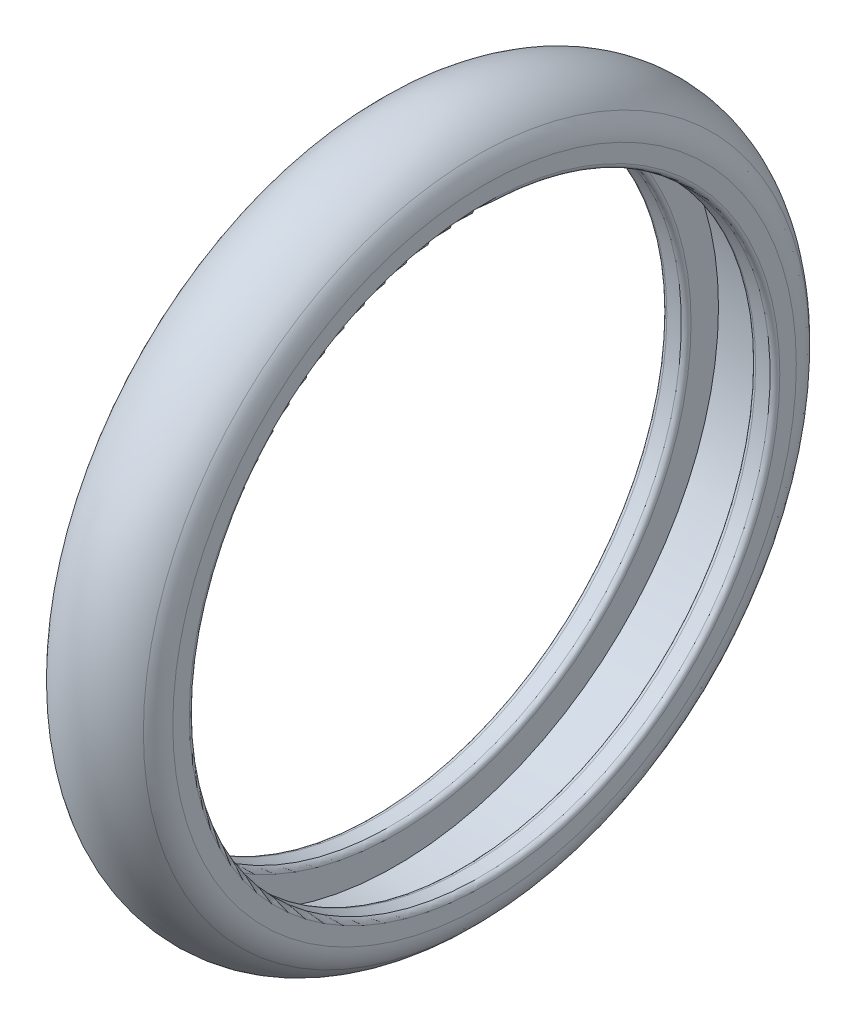
ISO-10303-21;
HEADER;
FILE_DESCRIPTION(('STEP AP214'),'2;1');
FILE_NAME('part.step','',(''),(''),'','','');
FILE_SCHEMA(('AUTOMOTIVE_DESIGN { 1 0 10303 214 1 1 1 1 }'));
ENDSEC;
DATA;
#1=APPLICATION_CONTEXT('core data for automotive mechanical design processes');
#2=APPLICATION_PROTOCOL_DEFINITION('international standard','automotive_design',2000,#1);
#3=PRODUCT_CONTEXT('',#1,'mechanical');
#4=PRODUCT('Part','Part','',(#3));
#5=PRODUCT_RELATED_PRODUCT_CATEGORY('part','',(#4));
#6=PRODUCT_DEFINITION_FORMATION('','',#4);
#7=PRODUCT_DEFINITION_CONTEXT('part definition',#1,'design');
#8=PRODUCT_DEFINITION('design','',#6,#7);
#9=PRODUCT_DEFINITION_SHAPE('','',#8);
#10=(LENGTH_UNIT() NAMED_UNIT(*) SI_UNIT(.MILLI.,.METRE.));
#11=(NAMED_UNIT(*) PLANE_ANGLE_UNIT() SI_UNIT($,.RADIAN.));
#12=(NAMED_UNIT(*) SI_UNIT($,.STERADIAN.) SOLID_ANGLE_UNIT());
#13=UNCERTAINTY_MEASURE_WITH_UNIT(LENGTH_MEASURE(1.E-05),#10,'distance_accuracy_value','');
#14=(GEOMETRIC_REPRESENTATION_CONTEXT(3) GLOBAL_UNCERTAINTY_ASSIGNED_CONTEXT((#13)) GLOBAL_UNIT_ASSIGNED_CONTEXT((#10,
#11,#12)) REPRESENTATION_CONTEXT('',''));
#15=CARTESIAN_POINT('',(0.,0.,0.));
#16=DIRECTION('',(0.,0.,1.));
#17=DIRECTION('',(1.,0.,0.));
#18=AXIS2_PLACEMENT_3D('',#15,#16,#17);
#19=CARTESIAN_POINT('',(0.,0.,0.));
#20=DIRECTION('',(-1.,0.,0.));
#21=DIRECTION('',(0.,0.,1.));
#22=AXIS2_PLACEMENT_3D('',#19,#20,#21);
#23=CYLINDRICAL_SURFACE('',#22,18.);
#24=CARTESIAN_POINT('',(2.3,0.,0.));
#25=DIRECTION('',(1.,0.,0.));
#26=DIRECTION('',(0.,0.,-1.));
#27=AXIS2_PLACEMENT_3D('',#24,#25,#26);
#28=CIRCLE('',#27,18.);
#29=CARTESIAN_POINT('',(2.3,0.,-18.));
#30=VERTEX_POINT('',#29);
#31=EDGE_CURVE('E68',#30,#30,#28,.F.);
#32=ORIENTED_EDGE('',*,*,#31,.T.);
#33=EDGE_LOOP('',(#32));
#34=FACE_BOUND('',#33,.T.);
#35=CARTESIAN_POINT('',(3.2,0.,0.));
#36=DIRECTION('',(-1.,0.,0.));
#37=DIRECTION('',(0.,0.,1.));
#38=AXIS2_PLACEMENT_3D('',#35,#36,#37);
#39=CIRCLE('',#38,18.);
#40=CARTESIAN_POINT('',(3.2,0.,18.));
#41=VERTEX_POINT('',#40);
#42=EDGE_CURVE('E72',#41,#41,#39,.F.);
#43=ORIENTED_EDGE('',*,*,#42,.T.);
#44=EDGE_LOOP('',(#43));
#45=FACE_BOUND('',#44,.T.);
#46=ADVANCED_FACE('F35',(#34,#45),#23,.F.);
#47=CARTESIAN_POINT('',(2.,20.,0.));
#48=DIRECTION('',(1.,0.,0.));
#49=DIRECTION('',(0.,0.,-1.));
#50=AXIS2_PLACEMENT_3D('',#47,#48,#49);
#51=PLANE('',#50);
#52=CARTESIAN_POINT('',(2.,0.,0.));
#53=DIRECTION('',(1.,0.,0.));
#54=DIRECTION('',(0.,0.,-1.));
#55=AXIS2_PLACEMENT_3D('',#52,#53,#54);
#56=CIRCLE('',#55,18.3);
#57=CARTESIAN_POINT('',(2.,0.,-18.3));
#58=VERTEX_POINT('',#57);
#59=EDGE_CURVE('E64',#58,#58,#56,.T.);
#60=ORIENTED_EDGE('',*,*,#59,.T.);
#61=EDGE_LOOP('',(#60));
#62=FACE_BOUND('',#61,.T.);
#63=CARTESIAN_POINT('',(2.,0.,0.));
#64=DIRECTION('',(-1.,0.,0.));
#65=DIRECTION('',(0.,0.,1.));
#66=AXIS2_PLACEMENT_3D('',#63,#64,#65);
#67=CIRCLE('',#66,20.);
#68=CARTESIAN_POINT('',(2.,0.,20.));
#69=VERTEX_POINT('',#68);
#70=EDGE_CURVE('E89',#69,#69,#67,.T.);
#71=ORIENTED_EDGE('',*,*,#70,.T.);
#72=EDGE_LOOP('',(#71));
#73=FACE_BOUND('',#72,.T.);
#74=ADVANCED_FACE('F112',(#62,#73),#51,.F.);
#75=CARTESIAN_POINT('',(0.,0.,0.));
#76=DIRECTION('',(-1.,0.,0.));
#77=DIRECTION('',(0.,0.,1.));
#78=AXIS2_PLACEMENT_3D('',#75,#76,#77);
#79=CYLINDRICAL_SURFACE('',#78,20.);
#80=ORIENTED_EDGE('',*,*,#70,.F.);
#81=EDGE_LOOP('',(#80));
#82=FACE_BOUND('',#81,.T.);
#83=CARTESIAN_POINT('',(-2.,0.,0.));
#84=DIRECTION('',(-1.,0.,0.));
#85=DIRECTION('',(0.,0.,1.));
#86=AXIS2_PLACEMENT_3D('',#83,#84,#85);
#87=CIRCLE('',#86,20.);
#88=CARTESIAN_POINT('',(-2.,0.,20.));
#89=VERTEX_POINT('',#88);
#90=EDGE_CURVE('E93',#89,#89,#87,.T.);
#91=ORIENTED_EDGE('',*,*,#90,.T.);
#92=EDGE_LOOP('',(#91));
#93=FACE_BOUND('',#92,.T.);
#94=ADVANCED_FACE('F98',(#82,#93),#79,.F.);
#95=CARTESIAN_POINT('',(-2.,20.,0.));
#96=DIRECTION('',(-1.,0.,0.));
#97=DIRECTION('',(0.,0.,1.));
#98=AXIS2_PLACEMENT_3D('',#95,#96,#97);
#99=PLANE('',#98);
#100=CARTESIAN_POINT('',(-2.,0.,0.));
#101=DIRECTION('',(-1.,0.,0.));
#102=DIRECTION('',(0.,0.,1.));
#103=AXIS2_PLACEMENT_3D('',#100,#101,#102);
#104=CIRCLE('',#103,18.3);
#105=CARTESIAN_POINT('',(-2.,0.,18.3));
#106=VERTEX_POINT('',#105);
#107=EDGE_CURVE('E60',#106,#106,#104,.T.);
#108=ORIENTED_EDGE('',*,*,#107,.T.);
#109=EDGE_LOOP('',(#108));
#110=FACE_BOUND('',#109,.T.);
#111=ORIENTED_EDGE('',*,*,#90,.F.);
#112=EDGE_LOOP('',(#111));
#113=FACE_BOUND('',#112,.T.);
#114=ADVANCED_FACE('F100',(#110,#113),#99,.F.);
#115=CARTESIAN_POINT('',(0.,0.,0.));
#116=DIRECTION('',(-1.,0.,0.));
#117=DIRECTION('',(0.,0.,1.));
#118=AXIS2_PLACEMENT_3D('',#115,#116,#117);
#119=CYLINDRICAL_SURFACE('',#118,18.);
#120=CARTESIAN_POINT('',(-2.3,0.,0.));
#121=DIRECTION('',(-1.,0.,0.));
#122=DIRECTION('',(0.,0.,1.));
#123=AXIS2_PLACEMENT_3D('',#120,#121,#122);
#124=CIRCLE('',#123,18.);
#125=CARTESIAN_POINT('',(-2.3,0.,18.));
#126=VERTEX_POINT('',#125);
#127=EDGE_CURVE('E47',#126,#126,#124,.F.);
#128=ORIENTED_EDGE('',*,*,#127,.T.);
#129=EDGE_LOOP('',(#128));
#130=FACE_BOUND('',#129,.T.);
#131=CARTESIAN_POINT('',(-3.2,0.,0.));
#132=DIRECTION('',(1.,0.,0.));
#133=DIRECTION('',(0.,0.,-1.));
#134=AXIS2_PLACEMENT_3D('',#131,#132,#133);
#135=CIRCLE('',#134,18.);
#136=CARTESIAN_POINT('',(-3.2,0.,-18.));
#137=VERTEX_POINT('',#136);
#138=EDGE_CURVE('E54',#137,#137,#135,.F.);
#139=ORIENTED_EDGE('',*,*,#138,.T.);
#140=EDGE_LOOP('',(#139));
#141=FACE_BOUND('',#140,.T.);
#142=ADVANCED_FACE('F102',(#130,#141),#119,.F.);
#143=CARTESIAN_POINT('',(-3.5,18.,0.));
#144=DIRECTION('',(1.,0.,0.));
#145=DIRECTION('',(0.,0.,-1.));
#146=AXIS2_PLACEMENT_3D('',#143,#144,#145);
#147=PLANE('',#146);
#148=CARTESIAN_POINT('',(-3.5,0.,0.));
#149=DIRECTION('',(1.,0.,0.));
#150=DIRECTION('',(0.,0.,-1.));
#151=AXIS2_PLACEMENT_3D('',#148,#149,#150);
#152=CIRCLE('',#151,18.3);
#153=CARTESIAN_POINT('',(-3.5,0.,-18.3));
#154=VERTEX_POINT('',#153);
#155=EDGE_CURVE('E42',#154,#154,#152,.T.);
#156=ORIENTED_EDGE('',*,*,#155,.T.);
#157=EDGE_LOOP('',(#156));
#158=FACE_BOUND('',#157,.T.);
#159=CARTESIAN_POINT('',(-3.5,0.,0.));
#160=DIRECTION('',(1.,0.,0.));
#161=DIRECTION('',(0.,0.,-1.));
#162=AXIS2_PLACEMENT_3D('',#159,#160,#161);
#163=CIRCLE('',#162,19.3228756555323);
#164=CARTESIAN_POINT('',(-3.5,0.,-19.3228756555323));
#165=VERTEX_POINT('',#164);
#166=EDGE_CURVE('E86',#165,#165,#163,.F.);
#167=ORIENTED_EDGE('',*,*,#166,.T.);
#168=EDGE_LOOP('',(#167));
#169=FACE_BOUND('',#168,.T.);
#170=ADVANCED_FACE('F109',(#158,#169),#147,.F.);
#171=CARTESIAN_POINT('',(0.,0.,0.));
#172=DIRECTION('',(-1.,0.,0.));
#173=DIRECTION('',(0.,0.,1.));
#174=AXIS2_PLACEMENT_3D('',#171,#172,#173);
#175=TOROIDAL_SURFACE('',#174,18.,4.);
#176=CARTESIAN_POINT('',(-2.99999999999999,0.,0.));
#177=DIRECTION('',(1.,0.,0.));
#178=DIRECTION('',(0.,0.,-1.));
#179=AXIS2_PLACEMENT_3D('',#176,#177,#178);
#180=CIRCLE('',#179,20.6457513110646);
#181=CARTESIAN_POINT('',(-2.99999999999999,0.,-20.6457513110646));
#182=VERTEX_POINT('',#181);
#183=EDGE_CURVE('E79',#182,#182,#180,.T.);
#184=ORIENTED_EDGE('',*,*,#183,.T.);
#185=EDGE_LOOP('',(#184));
#186=FACE_BOUND('',#185,.T.);
#187=CARTESIAN_POINT('',(2.99999999999999,0.,0.));
#188=DIRECTION('',(-1.,0.,0.));
#189=DIRECTION('',(0.,0.,1.));
#190=AXIS2_PLACEMENT_3D('',#187,#188,#189);
#191=CIRCLE('',#190,20.6457513110646);
#192=CARTESIAN_POINT('',(2.99999999999999,0.,20.6457513110646));
#193=VERTEX_POINT('',#192);
#194=EDGE_CURVE('E82',#193,#193,#191,.T.);
#195=ORIENTED_EDGE('',*,*,#194,.T.);
#196=EDGE_LOOP('',(#195));
#197=FACE_BOUND('',#196,.T.);
#198=ADVANCED_FACE('F184',(#186,#197),#175,.T.);
#199=CARTESIAN_POINT('',(3.5,18.,0.));
#200=DIRECTION('',(-1.,0.,0.));
#201=DIRECTION('',(0.,0.,1.));
#202=AXIS2_PLACEMENT_3D('',#199,#200,#201);
#203=PLANE('',#202);
#204=CARTESIAN_POINT('',(3.5,0.,0.));
#205=DIRECTION('',(-1.,0.,0.));
#206=DIRECTION('',(0.,0.,1.));
#207=AXIS2_PLACEMENT_3D('',#204,#205,#206);
#208=CIRCLE('',#207,18.3);
#209=CARTESIAN_POINT('',(3.5,0.,18.3));
#210=VERTEX_POINT('',#209);
#211=EDGE_CURVE('E10',#210,#210,#208,.T.);
#212=ORIENTED_EDGE('',*,*,#211,.T.);
#213=EDGE_LOOP('',(#212));
#214=FACE_BOUND('',#213,.T.);
#215=CARTESIAN_POINT('',(3.5,0.,0.));
#216=DIRECTION('',(-1.,0.,0.));
#217=DIRECTION('',(0.,0.,1.));
#218=AXIS2_PLACEMENT_3D('',#215,#216,#217);
#219=CIRCLE('',#218,19.3228756555323);
#220=CARTESIAN_POINT('',(3.5,0.,19.3228756555323));
#221=VERTEX_POINT('',#220);
#222=EDGE_CURVE('E75',#221,#221,#219,.F.);
#223=ORIENTED_EDGE('',*,*,#222,.T.);
#224=EDGE_LOOP('',(#223));
#225=FACE_BOUND('',#224,.T.);
#226=ADVANCED_FACE('F129',(#214,#225),#203,.F.);
#227=CARTESIAN_POINT('',(-1.5,0.,0.));
#228=DIRECTION('',(1.,0.,0.));
#229=DIRECTION('',(0.,0.,-1.));
#230=AXIS2_PLACEMENT_3D('',#227,#228,#229);
#231=TOROIDAL_SURFACE('',#230,19.3228756555323,2.);
#232=ORIENTED_EDGE('',*,*,#183,.F.);
#233=EDGE_LOOP('',(#232));
#234=FACE_BOUND('',#233,.T.);
#235=ORIENTED_EDGE('',*,*,#166,.F.);
#236=EDGE_LOOP('',(#235));
#237=FACE_BOUND('',#236,.T.);
#238=ADVANCED_FACE('F125',(#234,#237),#231,.T.);
#239=CARTESIAN_POINT('',(1.5,0.,0.));
#240=DIRECTION('',(-1.,0.,0.));
#241=DIRECTION('',(0.,0.,1.));
#242=AXIS2_PLACEMENT_3D('',#239,#240,#241);
#243=TOROIDAL_SURFACE('',#242,19.3228756555323,2.);
#244=ORIENTED_EDGE('',*,*,#222,.F.);
#245=EDGE_LOOP('',(#244));
#246=FACE_BOUND('',#245,.T.);
#247=ORIENTED_EDGE('',*,*,#194,.F.);
#248=EDGE_LOOP('',(#247));
#249=FACE_BOUND('',#248,.T.);
#250=ADVANCED_FACE('F128',(#246,#249),#243,.T.);
#251=CARTESIAN_POINT('',(2.3,0.,0.));
#252=DIRECTION('',(1.,0.,0.));
#253=DIRECTION('',(0.,0.,-1.));
#254=AXIS2_PLACEMENT_3D('',#251,#252,#253);
#255=TOROIDAL_SURFACE('',#254,18.3,0.3);
#256=ORIENTED_EDGE('',*,*,#59,.F.);
#257=EDGE_LOOP('',(#256));
#258=FACE_BOUND('',#257,.T.);
#259=ORIENTED_EDGE('',*,*,#31,.F.);
#260=EDGE_LOOP('',(#259));
#261=FACE_BOUND('',#260,.T.);
#262=ADVANCED_FACE('F133',(#258,#261),#255,.T.);
#263=CARTESIAN_POINT('',(-2.3,0.,0.));
#264=DIRECTION('',(-1.,0.,0.));
#265=DIRECTION('',(0.,0.,1.));
#266=AXIS2_PLACEMENT_3D('',#263,#264,#265);
#267=TOROIDAL_SURFACE('',#266,18.3,0.3);
#268=ORIENTED_EDGE('',*,*,#127,.F.);
#269=EDGE_LOOP('',(#268));
#270=FACE_BOUND('',#269,.T.);
#271=ORIENTED_EDGE('',*,*,#107,.F.);
#272=EDGE_LOOP('',(#271));
#273=FACE_BOUND('',#272,.T.);
#274=ADVANCED_FACE('F137',(#270,#273),#267,.T.);
#275=CARTESIAN_POINT('',(-3.2,0.,0.));
#276=DIRECTION('',(1.,0.,0.));
#277=DIRECTION('',(0.,0.,-1.));
#278=AXIS2_PLACEMENT_3D('',#275,#276,#277);
#279=TOROIDAL_SURFACE('',#278,18.3,0.3);
#280=ORIENTED_EDGE('',*,*,#155,.F.);
#281=EDGE_LOOP('',(#280));
#282=FACE_BOUND('',#281,.T.);
#283=ORIENTED_EDGE('',*,*,#138,.F.);
#284=EDGE_LOOP('',(#283));
#285=FACE_BOUND('',#284,.T.);
#286=ADVANCED_FACE('F140',(#282,#285),#279,.T.);
#287=CARTESIAN_POINT('',(3.2,0.,0.));
#288=DIRECTION('',(-1.,0.,0.));
#289=DIRECTION('',(0.,0.,1.));
#290=AXIS2_PLACEMENT_3D('',#287,#288,#289);
#291=TOROIDAL_SURFACE('',#290,18.3,0.3);
#292=ORIENTED_EDGE('',*,*,#42,.F.);
#293=EDGE_LOOP('',(#292));
#294=FACE_BOUND('',#293,.T.);
#295=ORIENTED_EDGE('',*,*,#211,.F.);
#296=EDGE_LOOP('',(#295));
#297=FACE_BOUND('',#296,.T.);
#298=ADVANCED_FACE('F37',(#294,#297),#291,.T.);
#299=CLOSED_SHELL('',(#46,#74,#94,#114,#142,#170,#198,#226,#238,#250,#262,#274,#286,#298));
#300=MANIFOLD_SOLID_BREP('B2',#299);
#301=ADVANCED_BREP_SHAPE_REPRESENTATION('',(#18,#300),#14);
#302=SHAPE_DEFINITION_REPRESENTATION(#9,#301);
ENDSEC;
END-ISO-10303-21;
